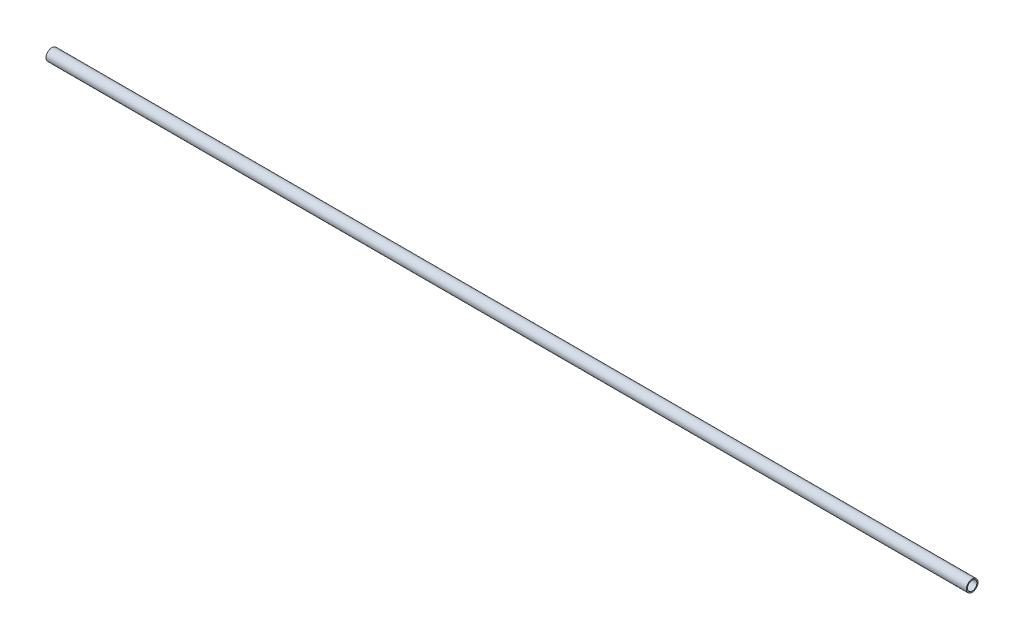
ISO-10303-21;
HEADER;
FILE_DESCRIPTION(('STEP AP214'),'2;1');
FILE_NAME('part.step','',(''),(''),'','','');
FILE_SCHEMA(('AUTOMOTIVE_DESIGN { 1 0 10303 214 1 1 1 1 }'));
ENDSEC;
DATA;
#1=APPLICATION_CONTEXT('core data for automotive mechanical design processes');
#2=APPLICATION_PROTOCOL_DEFINITION('international standard','automotive_design',2000,#1);
#3=PRODUCT_CONTEXT('',#1,'mechanical');
#4=PRODUCT('Part','Part','',(#3));
#5=PRODUCT_RELATED_PRODUCT_CATEGORY('part','',(#4));
#6=PRODUCT_DEFINITION_FORMATION('','',#4);
#7=PRODUCT_DEFINITION_CONTEXT('part definition',#1,'design');
#8=PRODUCT_DEFINITION('design','',#6,#7);
#9=PRODUCT_DEFINITION_SHAPE('','',#8);
#10=(LENGTH_UNIT() NAMED_UNIT(*) SI_UNIT(.MILLI.,.METRE.));
#11=(NAMED_UNIT(*) PLANE_ANGLE_UNIT() SI_UNIT($,.RADIAN.));
#12=(NAMED_UNIT(*) SI_UNIT($,.STERADIAN.) SOLID_ANGLE_UNIT());
#13=UNCERTAINTY_MEASURE_WITH_UNIT(LENGTH_MEASURE(1.E-05),#10,'distance_accuracy_value','');
#14=(GEOMETRIC_REPRESENTATION_CONTEXT(3) GLOBAL_UNCERTAINTY_ASSIGNED_CONTEXT((#13)) GLOBAL_UNIT_ASSIGNED_CONTEXT((#10,
#11,#12)) REPRESENTATION_CONTEXT('',''));
#15=CARTESIAN_POINT('',(0.,0.,0.));
#16=DIRECTION('',(0.,0.,1.));
#17=DIRECTION('',(1.,0.,0.));
#18=AXIS2_PLACEMENT_3D('',#15,#16,#17);
#19=CARTESIAN_POINT('',(40.,0.,0.));
#20=DIRECTION('',(1.,0.,0.));
#21=DIRECTION('',(0.,0.,-1.));
#22=AXIS2_PLACEMENT_3D('',#19,#20,#21);
#23=PLANE('',#22);
#24=CARTESIAN_POINT('',(40.,0.,0.));
#25=DIRECTION('',(1.,0.,0.));
#26=DIRECTION('',(0.,0.,-1.));
#27=AXIS2_PLACEMENT_3D('',#24,#25,#26);
#28=CIRCLE('',#27,0.254);
#29=CARTESIAN_POINT('',(40.,0.,-0.254));
#30=VERTEX_POINT('',#29);
#31=EDGE_CURVE('E10',#30,#30,#28,.T.);
#32=ORIENTED_EDGE('',*,*,#31,.T.);
#33=EDGE_LOOP('',(#32));
#34=FACE_BOUND('',#33,.T.);
#35=CARTESIAN_POINT('',(40.,0.,0.));
#36=DIRECTION('',(1.,0.,0.));
#37=DIRECTION('',(0.,0.,-1.));
#38=AXIS2_PLACEMENT_3D('',#35,#36,#37);
#39=CIRCLE('',#38,0.2032);
#40=CARTESIAN_POINT('',(40.,0.,-0.2032));
#41=VERTEX_POINT('',#40);
#42=EDGE_CURVE('E42',#41,#41,#39,.T.);
#43=ORIENTED_EDGE('',*,*,#42,.F.);
#44=EDGE_LOOP('',(#43));
#45=FACE_BOUND('',#44,.T.);
#46=ADVANCED_FACE('F31',(#34,#45),#23,.T.);
#47=CARTESIAN_POINT('',(0.,0.,0.));
#48=DIRECTION('',(1.,0.,0.));
#49=DIRECTION('',(0.,0.,-1.));
#50=AXIS2_PLACEMENT_3D('',#47,#48,#49);
#51=PLANE('',#50);
#52=CARTESIAN_POINT('',(0.,0.,0.));
#53=DIRECTION('',(1.,0.,0.));
#54=DIRECTION('',(0.,0.,-1.));
#55=AXIS2_PLACEMENT_3D('',#52,#53,#54);
#56=CIRCLE('',#55,0.254);
#57=CARTESIAN_POINT('',(0.,0.,-0.254));
#58=VERTEX_POINT('',#57);
#59=EDGE_CURVE('E35',#58,#58,#56,.T.);
#60=ORIENTED_EDGE('',*,*,#59,.F.);
#61=EDGE_LOOP('',(#60));
#62=FACE_BOUND('',#61,.T.);
#63=CARTESIAN_POINT('',(0.,0.,0.));
#64=DIRECTION('',(1.,0.,0.));
#65=DIRECTION('',(0.,0.,-1.));
#66=AXIS2_PLACEMENT_3D('',#63,#64,#65);
#67=CIRCLE('',#66,0.2032);
#68=CARTESIAN_POINT('',(0.,0.,-0.2032));
#69=VERTEX_POINT('',#68);
#70=EDGE_CURVE('E44',#69,#69,#67,.T.);
#71=ORIENTED_EDGE('',*,*,#70,.T.);
#72=EDGE_LOOP('',(#71));
#73=FACE_BOUND('',#72,.T.);
#74=ADVANCED_FACE('F54',(#62,#73),#51,.F.);
#75=CARTESIAN_POINT('',(40.,0.,0.));
#76=DIRECTION('',(-1.,0.,0.));
#77=DIRECTION('',(0.,0.,1.));
#78=AXIS2_PLACEMENT_3D('',#75,#76,#77);
#79=CYLINDRICAL_SURFACE('',#78,0.254);
#80=ORIENTED_EDGE('',*,*,#31,.F.);
#81=EDGE_LOOP('',(#80));
#82=FACE_BOUND('',#81,.T.);
#83=ORIENTED_EDGE('',*,*,#59,.T.);
#84=EDGE_LOOP('',(#83));
#85=FACE_BOUND('',#84,.T.);
#86=ADVANCED_FACE('F33',(#82,#85),#79,.T.);
#87=CARTESIAN_POINT('',(40.,0.,0.));
#88=DIRECTION('',(-1.,0.,0.));
#89=DIRECTION('',(0.,0.,1.));
#90=AXIS2_PLACEMENT_3D('',#87,#88,#89);
#91=CYLINDRICAL_SURFACE('',#90,0.2032);
#92=ORIENTED_EDGE('',*,*,#42,.T.);
#93=EDGE_LOOP('',(#92));
#94=FACE_BOUND('',#93,.T.);
#95=ORIENTED_EDGE('',*,*,#70,.F.);
#96=EDGE_LOOP('',(#95));
#97=FACE_BOUND('',#96,.T.);
#98=ADVANCED_FACE('F50',(#94,#97),#91,.F.);
#99=CLOSED_SHELL('',(#46,#74,#86,#98));
#100=MANIFOLD_SOLID_BREP('B2',#99);
#101=ADVANCED_BREP_SHAPE_REPRESENTATION('',(#18,#100),#14);
#102=SHAPE_DEFINITION_REPRESENTATION(#9,#101);
ENDSEC;
END-ISO-10303-21;
